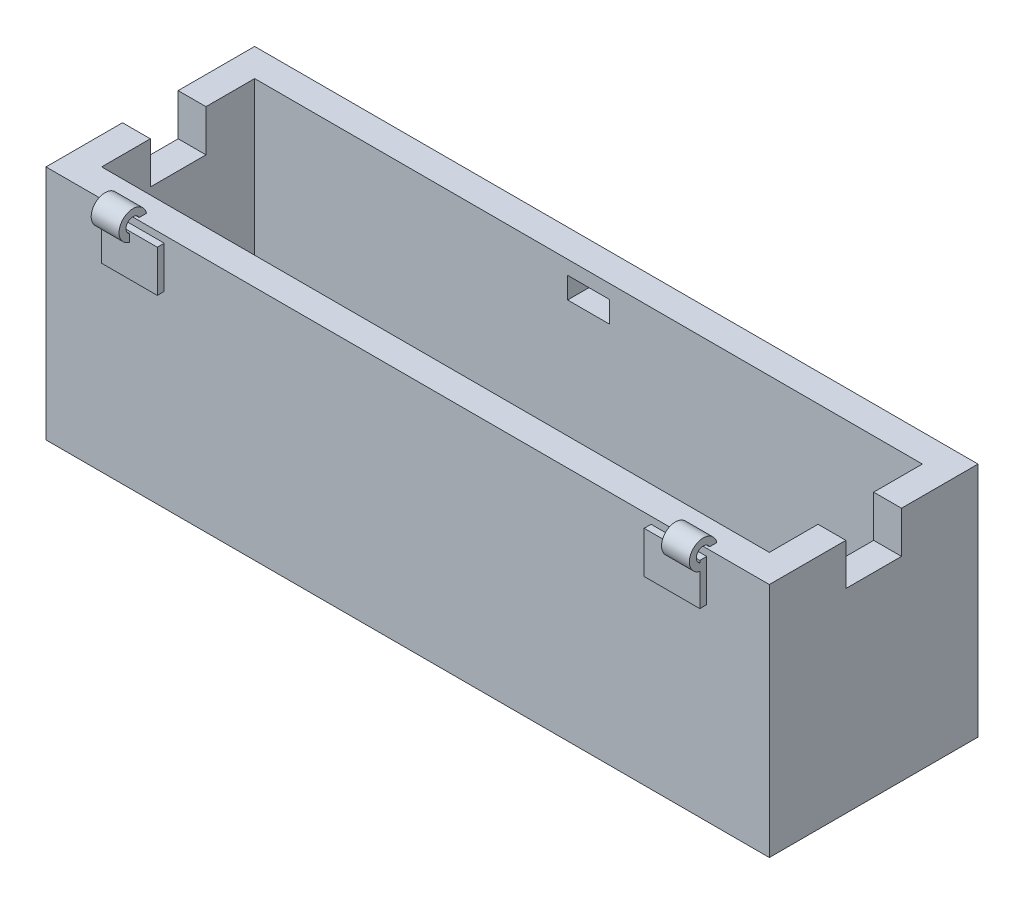
ISO-10303-21;
HEADER;
FILE_DESCRIPTION(('STEP AP214'),'2;1');
FILE_NAME('part.step','',(''),(''),'','','');
FILE_SCHEMA(('AUTOMOTIVE_DESIGN { 1 0 10303 214 1 1 1 1 }'));
ENDSEC;
DATA;
#1=APPLICATION_CONTEXT('core data for automotive mechanical design processes');
#2=APPLICATION_PROTOCOL_DEFINITION('international standard','automotive_design',2000,#1);
#3=PRODUCT_CONTEXT('',#1,'mechanical');
#4=PRODUCT('Part','Part','',(#3));
#5=PRODUCT_RELATED_PRODUCT_CATEGORY('part','',(#4));
#6=PRODUCT_DEFINITION_FORMATION('','',#4);
#7=PRODUCT_DEFINITION_CONTEXT('part definition',#1,'design');
#8=PRODUCT_DEFINITION('design','',#6,#7);
#9=PRODUCT_DEFINITION_SHAPE('','',#8);
#10=(LENGTH_UNIT() NAMED_UNIT(*) SI_UNIT(.MILLI.,.METRE.));
#11=(NAMED_UNIT(*) PLANE_ANGLE_UNIT() SI_UNIT($,.RADIAN.));
#12=(NAMED_UNIT(*) SI_UNIT($,.STERADIAN.) SOLID_ANGLE_UNIT());
#13=UNCERTAINTY_MEASURE_WITH_UNIT(LENGTH_MEASURE(1.E-05),#10,'distance_accuracy_value','');
#14=(GEOMETRIC_REPRESENTATION_CONTEXT(3) GLOBAL_UNCERTAINTY_ASSIGNED_CONTEXT((#13)) GLOBAL_UNIT_ASSIGNED_CONTEXT((#10,
#11,#12)) REPRESENTATION_CONTEXT('',''));
#15=CARTESIAN_POINT('',(0.,0.,0.));
#16=DIRECTION('',(0.,0.,1.));
#17=DIRECTION('',(1.,0.,0.));
#18=AXIS2_PLACEMENT_3D('',#15,#16,#17);
#19=CARTESIAN_POINT('',(0.,140.,0.));
#20=DIRECTION('',(0.,1.,0.));
#21=DIRECTION('',(0.,0.,1.));
#22=AXIS2_PLACEMENT_3D('',#19,#20,#21);
#23=PLANE('',#22);
#24=DIRECTION('',(-1.,0.,0.));
#25=VECTOR('',#24,1.);
#26=CARTESIAN_POINT('',(260.,140.,-20.0000000000002));
#27=LINE('',#26,#25);
#28=CARTESIAN_POINT('',(260.,140.,-20.0000000000002));
#29=VERTEX_POINT('',#28);
#30=CARTESIAN_POINT('',(240.,140.,-20.0000000000002));
#31=VERTEX_POINT('',#30);
#32=EDGE_CURVE('E340',#29,#31,#27,.T.);
#33=ORIENTED_EDGE('',*,*,#32,.F.);
#34=DIRECTION('',(0.,0.,-1.));
#35=VECTOR('',#34,1.);
#36=CARTESIAN_POINT('',(260.,140.,-75.));
#37=LINE('',#36,#35);
#38=CARTESIAN_POINT('',(260.,140.,-75.));
#39=VERTEX_POINT('',#38);
#40=EDGE_CURVE('E500',#29,#39,#37,.T.);
#41=ORIENTED_EDGE('',*,*,#40,.T.);
#42=DIRECTION('',(-1.,0.,0.));
#43=VECTOR('',#42,1.);
#44=CARTESIAN_POINT('',(-260.,140.,-75.));
#45=LINE('',#44,#43);
#46=CARTESIAN_POINT('',(15.,140.,-75.));
#47=VERTEX_POINT('',#46);
#48=EDGE_CURVE('E512',#39,#47,#45,.T.);
#49=ORIENTED_EDGE('',*,*,#48,.T.);
#50=CARTESIAN_POINT('',(-15.0000000000001,140.,-75.));
#51=VERTEX_POINT('',#50);
#52=EDGE_CURVE('E515',#47,#51,#45,.T.);
#53=ORIENTED_EDGE('',*,*,#52,.T.);
#54=CARTESIAN_POINT('',(-260.,140.,-75.));
#55=VERTEX_POINT('',#54);
#56=EDGE_CURVE('E511',#51,#55,#45,.T.);
#57=ORIENTED_EDGE('',*,*,#56,.T.);
#58=DIRECTION('',(0.,0.,1.));
#59=VECTOR('',#58,1.);
#60=CARTESIAN_POINT('',(-260.,140.,-75.));
#61=LINE('',#60,#59);
#62=CARTESIAN_POINT('',(-260.,140.,-20.));
#63=VERTEX_POINT('',#62);
#64=EDGE_CURVE('E516',#55,#63,#61,.T.);
#65=ORIENTED_EDGE('',*,*,#64,.T.);
#66=CARTESIAN_POINT('',(-240.,140.,-20.));
#67=VERTEX_POINT('',#66);
#68=EDGE_CURVE('E343',#67,#63,#27,.T.);
#69=ORIENTED_EDGE('',*,*,#68,.F.);
#70=DIRECTION('',(0.,0.,1.));
#71=VECTOR('',#70,1.);
#72=CARTESIAN_POINT('',(-240.,140.,-55.));
#73=LINE('',#72,#71);
#74=CARTESIAN_POINT('',(-240.,140.,-55.));
#75=VERTEX_POINT('',#74);
#76=EDGE_CURVE('E493',#75,#67,#73,.T.);
#77=ORIENTED_EDGE('',*,*,#76,.F.);
#78=DIRECTION('',(-1.,0.,0.));
#79=VECTOR('',#78,1.);
#80=CARTESIAN_POINT('',(-240.,140.,-55.));
#81=LINE('',#80,#79);
#82=CARTESIAN_POINT('',(240.,140.,-55.));
#83=VERTEX_POINT('',#82);
#84=EDGE_CURVE('E489',#83,#75,#81,.T.);
#85=ORIENTED_EDGE('',*,*,#84,.F.);
#86=DIRECTION('',(0.,0.,-1.));
#87=VECTOR('',#86,1.);
#88=CARTESIAN_POINT('',(240.,140.,-55.));
#89=LINE('',#88,#87);
#90=EDGE_CURVE('E471',#31,#83,#89,.T.);
#91=ORIENTED_EDGE('',*,*,#90,.F.);
#92=EDGE_LOOP('',(#33,#41,#49,#53,#57,#65,#69,#77,#85,#91));
#93=FACE_BOUND('',#92,.T.);
#94=ADVANCED_FACE('F45',(#93),#23,.T.);
#95=CARTESIAN_POINT('',(260.,140.,-75.));
#96=DIRECTION('',(-1.,0.,0.));
#97=DIRECTION('',(0.,0.,1.));
#98=AXIS2_PLACEMENT_3D('',#95,#96,#97);
#99=PLANE('',#98);
#100=ORIENTED_EDGE('',*,*,#40,.F.);
#101=DIRECTION('',(0.,-1.,0.));
#102=VECTOR('',#101,1.);
#103=CARTESIAN_POINT('',(260.,140.,-20.0000000000002));
#104=LINE('',#103,#102);
#105=CARTESIAN_POINT('',(260.,110.,-20.0000000000002));
#106=VERTEX_POINT('',#105);
#107=EDGE_CURVE('E323',#29,#106,#104,.T.);
#108=ORIENTED_EDGE('',*,*,#107,.T.);
#109=DIRECTION('',(0.,0.,1.));
#110=VECTOR('',#109,1.);
#111=CARTESIAN_POINT('',(260.,110.,-20.0000000000002));
#112=LINE('',#111,#110);
#113=CARTESIAN_POINT('',(260.,110.,19.9999999999998));
#114=VERTEX_POINT('',#113);
#115=EDGE_CURVE('E326',#106,#114,#112,.T.);
#116=ORIENTED_EDGE('',*,*,#115,.T.);
#117=DIRECTION('',(0.,1.,0.));
#118=VECTOR('',#117,1.);
#119=CARTESIAN_POINT('',(260.,140.,19.9999999999998));
#120=LINE('',#119,#118);
#121=CARTESIAN_POINT('',(260.,140.,19.9999999999998));
#122=VERTEX_POINT('',#121);
#123=EDGE_CURVE('E330',#114,#122,#120,.T.);
#124=ORIENTED_EDGE('',*,*,#123,.T.);
#125=CARTESIAN_POINT('',(260.,140.,75.));
#126=VERTEX_POINT('',#125);
#127=EDGE_CURVE('E508',#126,#122,#37,.T.);
#128=ORIENTED_EDGE('',*,*,#127,.F.);
#129=DIRECTION('',(0.,-1.,0.));
#130=VECTOR('',#129,1.);
#131=CARTESIAN_POINT('',(260.,140.,75.));
#132=LINE('',#131,#130);
#133=CARTESIAN_POINT('',(260.,-30.,75.));
#134=VERTEX_POINT('',#133);
#135=EDGE_CURVE('E521',#126,#134,#132,.T.);
#136=ORIENTED_EDGE('',*,*,#135,.T.);
#137=DIRECTION('',(0.,0.,1.));
#138=VECTOR('',#137,1.);
#139=CARTESIAN_POINT('',(260.,-30.,-75.));
#140=LINE('',#139,#138);
#141=CARTESIAN_POINT('',(260.,-30.,-75.));
#142=VERTEX_POINT('',#141);
#143=EDGE_CURVE('E316',#142,#134,#140,.T.);
#144=ORIENTED_EDGE('',*,*,#143,.F.);
#145=DIRECTION('',(0.,-1.,0.));
#146=VECTOR('',#145,1.);
#147=CARTESIAN_POINT('',(260.,140.,-75.));
#148=LINE('',#147,#146);
#149=EDGE_CURVE('E527',#39,#142,#148,.T.);
#150=ORIENTED_EDGE('',*,*,#149,.F.);
#151=EDGE_LOOP('',(#100,#108,#116,#124,#128,#136,#144,#150));
#152=FACE_BOUND('',#151,.T.);
#153=ADVANCED_FACE('F608',(#152),#99,.F.);
#154=CARTESIAN_POINT('',(-260.,140.,-75.));
#155=DIRECTION('',(0.,0.,1.));
#156=DIRECTION('',(1.,0.,0.));
#157=AXIS2_PLACEMENT_3D('',#154,#155,#156);
#158=PLANE('',#157);
#159=DIRECTION('',(0.,-1.,0.));
#160=VECTOR('',#159,1.);
#161=CARTESIAN_POINT('',(15.,130.,-75.));
#162=LINE('',#161,#160);
#163=CARTESIAN_POINT('',(15.,114.647041027345,-75.));
#164=VERTEX_POINT('',#163);
#165=EDGE_CURVE('E67',#47,#164,#162,.T.);
#166=ORIENTED_EDGE('',*,*,#165,.F.);
#167=ORIENTED_EDGE('',*,*,#48,.F.);
#168=ORIENTED_EDGE('',*,*,#149,.T.);
#169=DIRECTION('',(1.,0.,0.));
#170=VECTOR('',#169,1.);
#171=CARTESIAN_POINT('',(-260.,-30.,-75.));
#172=LINE('',#171,#170);
#173=CARTESIAN_POINT('',(-260.,-30.,-75.));
#174=VERTEX_POINT('',#173);
#175=EDGE_CURVE('E313',#174,#142,#172,.T.);
#176=ORIENTED_EDGE('',*,*,#175,.F.);
#177=DIRECTION('',(0.,-1.,0.));
#178=VECTOR('',#177,1.);
#179=CARTESIAN_POINT('',(-260.,140.,-75.));
#180=LINE('',#179,#178);
#181=EDGE_CURVE('E525',#55,#174,#180,.T.);
#182=ORIENTED_EDGE('',*,*,#181,.F.);
#183=ORIENTED_EDGE('',*,*,#56,.F.);
#184=DIRECTION('',(0.,1.,0.));
#185=VECTOR('',#184,1.);
#186=CARTESIAN_POINT('',(-15.0000000000001,130.,-75.));
#187=LINE('',#186,#185);
#188=CARTESIAN_POINT('',(-15.0000000000001,114.647041027345,-75.));
#189=VERTEX_POINT('',#188);
#190=EDGE_CURVE('E59',#189,#51,#187,.T.);
#191=ORIENTED_EDGE('',*,*,#190,.F.);
#192=DIRECTION('',(-1.,0.,0.));
#193=VECTOR('',#192,1.);
#194=CARTESIAN_POINT('',(15.,114.647041027345,-75.));
#195=LINE('',#194,#193);
#196=EDGE_CURVE('E288',#164,#189,#195,.T.);
#197=ORIENTED_EDGE('',*,*,#196,.F.);
#198=EDGE_LOOP('',(#166,#167,#168,#176,#182,#183,#191,#197));
#199=FACE_BOUND('',#198,.T.);
#200=ADVANCED_FACE('F301',(#199),#158,.F.);
#201=CARTESIAN_POINT('',(-260.,140.,-75.));
#202=DIRECTION('',(1.,0.,0.));
#203=DIRECTION('',(0.,0.,-1.));
#204=AXIS2_PLACEMENT_3D('',#201,#202,#203);
#205=PLANE('',#204);
#206=DIRECTION('',(0.,0.,1.));
#207=VECTOR('',#206,1.);
#208=CARTESIAN_POINT('',(-260.,110.,-20.));
#209=LINE('',#208,#207);
#210=CARTESIAN_POINT('',(-260.,110.,-20.));
#211=VERTEX_POINT('',#210);
#212=CARTESIAN_POINT('',(-260.,110.,20.));
#213=VERTEX_POINT('',#212);
#214=EDGE_CURVE('E336',#211,#213,#209,.T.);
#215=ORIENTED_EDGE('',*,*,#214,.F.);
#216=DIRECTION('',(0.,-1.,0.));
#217=VECTOR('',#216,1.);
#218=CARTESIAN_POINT('',(-260.,140.,-20.));
#219=LINE('',#218,#217);
#220=EDGE_CURVE('E322',#63,#211,#219,.T.);
#221=ORIENTED_EDGE('',*,*,#220,.F.);
#222=ORIENTED_EDGE('',*,*,#64,.F.);
#223=ORIENTED_EDGE('',*,*,#181,.T.);
#224=DIRECTION('',(0.,0.,-1.));
#225=VECTOR('',#224,1.);
#226=CARTESIAN_POINT('',(-260.,-30.,-75.));
#227=LINE('',#226,#225);
#228=CARTESIAN_POINT('',(-260.,-30.,75.));
#229=VERTEX_POINT('',#228);
#230=EDGE_CURVE('E308',#229,#174,#227,.T.);
#231=ORIENTED_EDGE('',*,*,#230,.F.);
#232=DIRECTION('',(0.,-1.,0.));
#233=VECTOR('',#232,1.);
#234=CARTESIAN_POINT('',(-260.,140.,75.));
#235=LINE('',#234,#233);
#236=CARTESIAN_POINT('',(-260.,140.,75.));
#237=VERTEX_POINT('',#236);
#238=EDGE_CURVE('E523',#237,#229,#235,.T.);
#239=ORIENTED_EDGE('',*,*,#238,.F.);
#240=CARTESIAN_POINT('',(-260.,140.,20.));
#241=VERTEX_POINT('',#240);
#242=EDGE_CURVE('E514',#241,#237,#61,.T.);
#243=ORIENTED_EDGE('',*,*,#242,.F.);
#244=DIRECTION('',(0.,1.,0.));
#245=VECTOR('',#244,1.);
#246=CARTESIAN_POINT('',(-260.,140.,20.));
#247=LINE('',#246,#245);
#248=EDGE_CURVE('E327',#213,#241,#247,.T.);
#249=ORIENTED_EDGE('',*,*,#248,.F.);
#250=EDGE_LOOP('',(#215,#221,#222,#223,#231,#239,#243,#249));
#251=FACE_BOUND('',#250,.T.);
#252=ADVANCED_FACE('F587',(#251),#205,.F.);
#253=CARTESIAN_POINT('',(-260.,140.,75.));
#254=DIRECTION('',(0.,0.,-1.));
#255=DIRECTION('',(-1.,0.,0.));
#256=AXIS2_PLACEMENT_3D('',#253,#254,#255);
#257=PLANE('',#256);
#258=DIRECTION('',(1.,0.,0.));
#259=VECTOR('',#258,1.);
#260=CARTESIAN_POINT('',(-260.,135.,75.));
#261=LINE('',#260,#259);
#262=CARTESIAN_POINT('',(175.,135.,75.));
#263=VERTEX_POINT('',#262);
#264=CARTESIAN_POINT('',(215.,135.,75.));
#265=VERTEX_POINT('',#264);
#266=EDGE_CURVE('E421',#263,#265,#261,.T.);
#267=ORIENTED_EDGE('',*,*,#266,.T.);
#268=DIRECTION('',(0.,-1.,0.));
#269=VECTOR('',#268,1.);
#270=CARTESIAN_POINT('',(215.,140.,75.));
#271=LINE('',#270,#269);
#272=CARTESIAN_POINT('',(215.,105.,75.));
#273=VERTEX_POINT('',#272);
#274=EDGE_CURVE('E436',#265,#273,#271,.T.);
#275=ORIENTED_EDGE('',*,*,#274,.T.);
#276=DIRECTION('',(-1.,0.,0.));
#277=VECTOR('',#276,1.);
#278=CARTESIAN_POINT('',(-260.,105.,75.));
#279=LINE('',#278,#277);
#280=CARTESIAN_POINT('',(175.,105.,75.));
#281=VERTEX_POINT('',#280);
#282=EDGE_CURVE('E433',#273,#281,#279,.T.);
#283=ORIENTED_EDGE('',*,*,#282,.T.);
#284=DIRECTION('',(0.,1.,0.));
#285=VECTOR('',#284,1.);
#286=CARTESIAN_POINT('',(175.,140.,75.));
#287=LINE('',#286,#285);
#288=EDGE_CURVE('E430',#281,#263,#287,.T.);
#289=ORIENTED_EDGE('',*,*,#288,.T.);
#290=EDGE_LOOP('',(#267,#275,#283,#289));
#291=FACE_BOUND('',#290,.T.);
#292=DIRECTION('',(1.,0.,0.));
#293=VECTOR('',#292,1.);
#294=CARTESIAN_POINT('',(-260.,135.,75.));
#295=LINE('',#294,#293);
#296=CARTESIAN_POINT('',(-215.,135.,75.));
#297=VERTEX_POINT('',#296);
#298=CARTESIAN_POINT('',(-175.,135.,75.));
#299=VERTEX_POINT('',#298);
#300=EDGE_CURVE('E454',#297,#299,#295,.T.);
#301=ORIENTED_EDGE('',*,*,#300,.T.);
#302=DIRECTION('',(0.,-1.,0.));
#303=VECTOR('',#302,1.);
#304=CARTESIAN_POINT('',(-175.,140.,75.));
#305=LINE('',#304,#303);
#306=CARTESIAN_POINT('',(-175.,105.,75.));
#307=VERTEX_POINT('',#306);
#308=EDGE_CURVE('E468',#299,#307,#305,.T.);
#309=ORIENTED_EDGE('',*,*,#308,.T.);
#310=DIRECTION('',(-1.,0.,0.));
#311=VECTOR('',#310,1.);
#312=CARTESIAN_POINT('',(-260.,105.,75.));
#313=LINE('',#312,#311);
#314=CARTESIAN_POINT('',(-215.,105.,75.));
#315=VERTEX_POINT('',#314);
#316=EDGE_CURVE('E465',#307,#315,#313,.T.);
#317=ORIENTED_EDGE('',*,*,#316,.T.);
#318=DIRECTION('',(0.,1.,0.));
#319=VECTOR('',#318,1.);
#320=CARTESIAN_POINT('',(-215.,140.,75.));
#321=LINE('',#320,#319);
#322=EDGE_CURVE('E463',#315,#297,#321,.T.);
#323=ORIENTED_EDGE('',*,*,#322,.T.);
#324=EDGE_LOOP('',(#301,#309,#317,#323));
#325=FACE_BOUND('',#324,.T.);
#326=ORIENTED_EDGE('',*,*,#238,.T.);
#327=DIRECTION('',(-1.,0.,0.));
#328=VECTOR('',#327,1.);
#329=CARTESIAN_POINT('',(-260.,-30.,75.));
#330=LINE('',#329,#328);
#331=EDGE_CURVE('E319',#134,#229,#330,.T.);
#332=ORIENTED_EDGE('',*,*,#331,.F.);
#333=ORIENTED_EDGE('',*,*,#135,.F.);
#334=DIRECTION('',(1.,0.,0.));
#335=VECTOR('',#334,1.);
#336=CARTESIAN_POINT('',(-260.,140.,75.));
#337=LINE('',#336,#335);
#338=EDGE_CURVE('E519',#237,#126,#337,.T.);
#339=ORIENTED_EDGE('',*,*,#338,.F.);
#340=EDGE_LOOP('',(#326,#332,#333,#339));
#341=FACE_BOUND('',#340,.T.);
#342=ADVANCED_FACE('F618',(#291,#325,#341),#257,.F.);
#343=DIRECTION('',(-1.,0.,0.));
#344=VECTOR('',#343,1.);
#345=CARTESIAN_POINT('',(260.,140.,19.9999999999998));
#346=LINE('',#345,#344);
#347=CARTESIAN_POINT('',(-240.,140.,20.));
#348=VERTEX_POINT('',#347);
#349=EDGE_CURVE('E347',#348,#241,#346,.T.);
#350=ORIENTED_EDGE('',*,*,#349,.T.);
#351=ORIENTED_EDGE('',*,*,#242,.T.);
#352=ORIENTED_EDGE('',*,*,#338,.T.);
#353=ORIENTED_EDGE('',*,*,#127,.T.);
#354=CARTESIAN_POINT('',(240.,140.,19.9999999999998));
#355=VERTEX_POINT('',#354);
#356=EDGE_CURVE('E344',#122,#355,#346,.T.);
#357=ORIENTED_EDGE('',*,*,#356,.T.);
#358=CARTESIAN_POINT('',(240.,140.,55.));
#359=VERTEX_POINT('',#358);
#360=EDGE_CURVE('E486',#359,#355,#89,.T.);
#361=ORIENTED_EDGE('',*,*,#360,.F.);
#362=DIRECTION('',(1.,0.,0.));
#363=VECTOR('',#362,1.);
#364=CARTESIAN_POINT('',(-240.,140.,55.));
#365=LINE('',#364,#363);
#366=CARTESIAN_POINT('',(-240.,140.,55.));
#367=VERTEX_POINT('',#366);
#368=EDGE_CURVE('E476',#367,#359,#365,.T.);
#369=ORIENTED_EDGE('',*,*,#368,.F.);
#370=EDGE_CURVE('E492',#348,#367,#73,.T.);
#371=ORIENTED_EDGE('',*,*,#370,.F.);
#372=EDGE_LOOP('',(#350,#351,#352,#353,#357,#361,#369,#371));
#373=FACE_BOUND('',#372,.T.);
#374=DIRECTION('',(-1.,0.,0.));
#375=VECTOR('',#374,1.);
#376=CARTESIAN_POINT('',(-195.,140.,67.7530526368508));
#377=LINE('',#376,#375);
#378=CARTESIAN_POINT('',(-195.,140.,67.7530526368508));
#379=VERTEX_POINT('',#378);
#380=CARTESIAN_POINT('',(-215.,140.,67.7530526368508));
#381=VERTEX_POINT('',#380);
#382=EDGE_CURVE('E382',#379,#381,#377,.T.);
#383=ORIENTED_EDGE('',*,*,#382,.F.);
#384=DIRECTION('',(0.,0.,1.));
#385=VECTOR('',#384,1.);
#386=CARTESIAN_POINT('',(-195.,140.,0.));
#387=LINE('',#386,#385);
#388=CARTESIAN_POINT('',(-195.,140.,73.0275305590748));
#389=VERTEX_POINT('',#388);
#390=EDGE_CURVE('E379',#379,#389,#387,.T.);
#391=ORIENTED_EDGE('',*,*,#390,.T.);
#392=DIRECTION('',(-1.,0.,0.));
#393=VECTOR('',#392,1.);
#394=CARTESIAN_POINT('',(-195.,140.,73.0275305590748));
#395=LINE('',#394,#393);
#396=CARTESIAN_POINT('',(-215.,140.,73.0275305590748));
#397=VERTEX_POINT('',#396);
#398=EDGE_CURVE('E371',#389,#397,#395,.T.);
#399=ORIENTED_EDGE('',*,*,#398,.T.);
#400=DIRECTION('',(0.,0.,1.));
#401=VECTOR('',#400,1.);
#402=CARTESIAN_POINT('',(-215.,140.,0.));
#403=LINE('',#402,#401);
#404=EDGE_CURVE('E376',#381,#397,#403,.T.);
#405=ORIENTED_EDGE('',*,*,#404,.F.);
#406=EDGE_LOOP('',(#383,#391,#399,#405));
#407=FACE_BOUND('',#406,.T.);
#408=DIRECTION('',(1.,0.,0.));
#409=VECTOR('',#408,1.);
#410=CARTESIAN_POINT('',(195.,140.,67.7530526368488));
#411=LINE('',#410,#409);
#412=CARTESIAN_POINT('',(215.,140.,67.7530526368488));
#413=VERTEX_POINT('',#412);
#414=CARTESIAN_POINT('',(195.,140.,67.7530526368488));
#415=VERTEX_POINT('',#414);
#416=EDGE_CURVE('E403',#413,#415,#411,.F.);
#417=ORIENTED_EDGE('',*,*,#416,.F.);
#418=DIRECTION('',(0.,0.,-1.));
#419=VECTOR('',#418,1.);
#420=CARTESIAN_POINT('',(215.,140.,0.));
#421=LINE('',#420,#419);
#422=CARTESIAN_POINT('',(215.,140.,73.0275305590714));
#423=VERTEX_POINT('',#422);
#424=EDGE_CURVE('E398',#423,#413,#421,.T.);
#425=ORIENTED_EDGE('',*,*,#424,.F.);
#426=DIRECTION('',(1.,0.,0.));
#427=VECTOR('',#426,1.);
#428=CARTESIAN_POINT('',(195.,140.,73.0275305590714));
#429=LINE('',#428,#427);
#430=CARTESIAN_POINT('',(195.,140.,73.0275305590714));
#431=VERTEX_POINT('',#430);
#432=EDGE_CURVE('E393',#423,#431,#429,.F.);
#433=ORIENTED_EDGE('',*,*,#432,.T.);
#434=DIRECTION('',(0.,0.,-1.));
#435=VECTOR('',#434,1.);
#436=CARTESIAN_POINT('',(195.,140.,0.));
#437=LINE('',#436,#435);
#438=EDGE_CURVE('E400',#431,#415,#437,.T.);
#439=ORIENTED_EDGE('',*,*,#438,.T.);
#440=EDGE_LOOP('',(#417,#425,#433,#439));
#441=FACE_BOUND('',#440,.T.);
#442=ADVANCED_FACE('F623',(#373,#407,#441),#23,.T.);
#443=CARTESIAN_POINT('',(240.,20.,-55.));
#444=DIRECTION('',(1.,0.,0.));
#445=DIRECTION('',(0.,0.,-1.));
#446=AXIS2_PLACEMENT_3D('',#443,#444,#445);
#447=PLANE('',#446);
#448=DIRECTION('',(0.,0.,-1.));
#449=VECTOR('',#448,1.);
#450=CARTESIAN_POINT('',(240.,110.,-55.));
#451=LINE('',#450,#449);
#452=CARTESIAN_POINT('',(240.,110.,19.9999999999998));
#453=VERTEX_POINT('',#452);
#454=CARTESIAN_POINT('',(240.,110.,-20.0000000000002));
#455=VERTEX_POINT('',#454);
#456=EDGE_CURVE('E342',#453,#455,#451,.T.);
#457=ORIENTED_EDGE('',*,*,#456,.T.);
#458=DIRECTION('',(0.,1.,0.));
#459=VECTOR('',#458,1.);
#460=CARTESIAN_POINT('',(240.,20.,-20.0000000000002));
#461=LINE('',#460,#459);
#462=EDGE_CURVE('E359',#455,#31,#461,.T.);
#463=ORIENTED_EDGE('',*,*,#462,.T.);
#464=ORIENTED_EDGE('',*,*,#90,.T.);
#465=DIRECTION('',(0.,1.,0.));
#466=VECTOR('',#465,1.);
#467=CARTESIAN_POINT('',(240.,20.,-55.));
#468=LINE('',#467,#466);
#469=CARTESIAN_POINT('',(240.,20.,-55.));
#470=VERTEX_POINT('',#469);
#471=EDGE_CURVE('E485',#470,#83,#468,.T.);
#472=ORIENTED_EDGE('',*,*,#471,.F.);
#473=DIRECTION('',(0.,0.,-1.));
#474=VECTOR('',#473,1.);
#475=CARTESIAN_POINT('',(240.,20.,-55.));
#476=LINE('',#475,#474);
#477=CARTESIAN_POINT('',(240.,20.,55.));
#478=VERTEX_POINT('',#477);
#479=EDGE_CURVE('E472',#478,#470,#476,.T.);
#480=ORIENTED_EDGE('',*,*,#479,.F.);
#481=DIRECTION('',(0.,1.,0.));
#482=VECTOR('',#481,1.);
#483=CARTESIAN_POINT('',(240.,20.,55.));
#484=LINE('',#483,#482);
#485=EDGE_CURVE('E498',#478,#359,#484,.T.);
#486=ORIENTED_EDGE('',*,*,#485,.T.);
#487=ORIENTED_EDGE('',*,*,#360,.T.);
#488=DIRECTION('',(0.,-1.,0.));
#489=VECTOR('',#488,1.);
#490=CARTESIAN_POINT('',(240.,20.,19.9999999999998));
#491=LINE('',#490,#489);
#492=EDGE_CURVE('E356',#355,#453,#491,.T.);
#493=ORIENTED_EDGE('',*,*,#492,.T.);
#494=EDGE_LOOP('',(#457,#463,#464,#472,#480,#486,#487,#493));
#495=FACE_BOUND('',#494,.T.);
#496=ADVANCED_FACE('F601',(#495),#447,.F.);
#497=CARTESIAN_POINT('',(-240.,20.,55.));
#498=DIRECTION('',(0.,0.,1.));
#499=DIRECTION('',(1.,0.,0.));
#500=AXIS2_PLACEMENT_3D('',#497,#498,#499);
#501=PLANE('',#500);
#502=ORIENTED_EDGE('',*,*,#368,.T.);
#503=ORIENTED_EDGE('',*,*,#485,.F.);
#504=DIRECTION('',(1.,0.,0.));
#505=VECTOR('',#504,1.);
#506=CARTESIAN_POINT('',(-240.,20.,55.));
#507=LINE('',#506,#505);
#508=CARTESIAN_POINT('',(-240.,20.,55.));
#509=VERTEX_POINT('',#508);
#510=EDGE_CURVE('E482',#509,#478,#507,.T.);
#511=ORIENTED_EDGE('',*,*,#510,.F.);
#512=DIRECTION('',(0.,1.,0.));
#513=VECTOR('',#512,1.);
#514=CARTESIAN_POINT('',(-240.,20.,55.));
#515=LINE('',#514,#513);
#516=EDGE_CURVE('E501',#509,#367,#515,.T.);
#517=ORIENTED_EDGE('',*,*,#516,.T.);
#518=EDGE_LOOP('',(#502,#503,#511,#517));
#519=FACE_BOUND('',#518,.T.);
#520=ADVANCED_FACE('F660',(#519),#501,.F.);
#521=CARTESIAN_POINT('',(-240.,20.,-55.));
#522=DIRECTION('',(-1.,0.,0.));
#523=DIRECTION('',(0.,0.,1.));
#524=AXIS2_PLACEMENT_3D('',#521,#522,#523);
#525=PLANE('',#524);
#526=ORIENTED_EDGE('',*,*,#76,.T.);
#527=DIRECTION('',(0.,-1.,0.));
#528=VECTOR('',#527,1.);
#529=CARTESIAN_POINT('',(-240.,20.,-20.));
#530=LINE('',#529,#528);
#531=CARTESIAN_POINT('',(-240.,110.,-20.));
#532=VERTEX_POINT('',#531);
#533=EDGE_CURVE('E551',#67,#532,#530,.T.);
#534=ORIENTED_EDGE('',*,*,#533,.T.);
#535=DIRECTION('',(0.,0.,1.));
#536=VECTOR('',#535,1.);
#537=CARTESIAN_POINT('',(-240.,110.,-55.));
#538=LINE('',#537,#536);
#539=CARTESIAN_POINT('',(-240.,110.,20.));
#540=VERTEX_POINT('',#539);
#541=EDGE_CURVE('E545',#532,#540,#538,.T.);
#542=ORIENTED_EDGE('',*,*,#541,.T.);
#543=DIRECTION('',(0.,1.,0.));
#544=VECTOR('',#543,1.);
#545=CARTESIAN_POINT('',(-240.,20.,20.));
#546=LINE('',#545,#544);
#547=EDGE_CURVE('E548',#540,#348,#546,.T.);
#548=ORIENTED_EDGE('',*,*,#547,.T.);
#549=ORIENTED_EDGE('',*,*,#370,.T.);
#550=ORIENTED_EDGE('',*,*,#516,.F.);
#551=DIRECTION('',(0.,0.,1.));
#552=VECTOR('',#551,1.);
#553=CARTESIAN_POINT('',(-240.,20.,-55.));
#554=LINE('',#553,#552);
#555=CARTESIAN_POINT('',(-240.,20.,-55.));
#556=VERTEX_POINT('',#555);
#557=EDGE_CURVE('E479',#556,#509,#554,.T.);
#558=ORIENTED_EDGE('',*,*,#557,.F.);
#559=DIRECTION('',(0.,1.,0.));
#560=VECTOR('',#559,1.);
#561=CARTESIAN_POINT('',(-240.,20.,-55.));
#562=LINE('',#561,#560);
#563=EDGE_CURVE('E504',#556,#75,#562,.T.);
#564=ORIENTED_EDGE('',*,*,#563,.T.);
#565=EDGE_LOOP('',(#526,#534,#542,#548,#549,#550,#558,#564));
#566=FACE_BOUND('',#565,.T.);
#567=ADVANCED_FACE('F595',(#566),#525,.F.);
#568=CARTESIAN_POINT('',(-240.,20.,-55.));
#569=DIRECTION('',(0.,0.,-1.));
#570=DIRECTION('',(-1.,0.,0.));
#571=AXIS2_PLACEMENT_3D('',#568,#569,#570);
#572=PLANE('',#571);
#573=DIRECTION('',(-1.,0.,0.));
#574=VECTOR('',#573,1.);
#575=CARTESIAN_POINT('',(-240.,114.647041027345,-55.));
#576=LINE('',#575,#574);
#577=CARTESIAN_POINT('',(15.,114.647041027345,-55.));
#578=VERTEX_POINT('',#577);
#579=CARTESIAN_POINT('',(-15.0000000000001,114.647041027345,-55.));
#580=VERTEX_POINT('',#579);
#581=EDGE_CURVE('E290',#578,#580,#576,.T.);
#582=ORIENTED_EDGE('',*,*,#581,.T.);
#583=DIRECTION('',(0.,1.,0.));
#584=VECTOR('',#583,1.);
#585=CARTESIAN_POINT('',(-15.0000000000001,20.,-55.));
#586=LINE('',#585,#584);
#587=CARTESIAN_POINT('',(-15.0000000000001,130.,-55.));
#588=VERTEX_POINT('',#587);
#589=EDGE_CURVE('E560',#580,#588,#586,.T.);
#590=ORIENTED_EDGE('',*,*,#589,.T.);
#591=DIRECTION('',(1.,0.,0.));
#592=VECTOR('',#591,1.);
#593=CARTESIAN_POINT('',(-240.,130.,-55.));
#594=LINE('',#593,#592);
#595=CARTESIAN_POINT('',(15.,130.,-55.));
#596=VERTEX_POINT('',#595);
#597=EDGE_CURVE('E554',#588,#596,#594,.T.);
#598=ORIENTED_EDGE('',*,*,#597,.T.);
#599=DIRECTION('',(0.,-1.,0.));
#600=VECTOR('',#599,1.);
#601=CARTESIAN_POINT('',(14.9999999999999,20.,-55.));
#602=LINE('',#601,#600);
#603=EDGE_CURVE('E557',#596,#578,#602,.T.);
#604=ORIENTED_EDGE('',*,*,#603,.T.);
#605=EDGE_LOOP('',(#582,#590,#598,#604));
#606=FACE_BOUND('',#605,.T.);
#607=ORIENTED_EDGE('',*,*,#84,.T.);
#608=ORIENTED_EDGE('',*,*,#563,.F.);
#609=DIRECTION('',(-1.,0.,0.));
#610=VECTOR('',#609,1.);
#611=CARTESIAN_POINT('',(-240.,20.,-55.));
#612=LINE('',#611,#610);
#613=EDGE_CURVE('E475',#470,#556,#612,.T.);
#614=ORIENTED_EDGE('',*,*,#613,.F.);
#615=ORIENTED_EDGE('',*,*,#471,.T.);
#616=EDGE_LOOP('',(#607,#608,#614,#615));
#617=FACE_BOUND('',#616,.T.);
#618=ADVANCED_FACE('F572',(#606,#617),#572,.F.);
#619=CARTESIAN_POINT('',(0.,20.,0.));
#620=DIRECTION('',(0.,1.,0.));
#621=DIRECTION('',(0.,0.,1.));
#622=AXIS2_PLACEMENT_3D('',#619,#620,#621);
#623=PLANE('',#622);
#624=ORIENTED_EDGE('',*,*,#479,.T.);
#625=ORIENTED_EDGE('',*,*,#613,.T.);
#626=ORIENTED_EDGE('',*,*,#557,.T.);
#627=ORIENTED_EDGE('',*,*,#510,.T.);
#628=EDGE_LOOP('',(#624,#625,#626,#627));
#629=FACE_BOUND('',#628,.T.);
#630=ADVANCED_FACE('F717',(#629),#623,.T.);
#631=CARTESIAN_POINT('',(-175.,135.,50.));
#632=DIRECTION('',(1.,0.,0.));
#633=DIRECTION('',(0.,0.,-1.));
#634=AXIS2_PLACEMENT_3D('',#631,#632,#633);
#635=PLANE('',#634);
#636=ORIENTED_EDGE('',*,*,#308,.F.);
#637=DIRECTION('',(0.,0.,1.));
#638=VECTOR('',#637,1.);
#639=CARTESIAN_POINT('',(-175.,135.,50.));
#640=LINE('',#639,#638);
#641=CARTESIAN_POINT('',(-175.,135.,80.));
#642=VERTEX_POINT('',#641);
#643=EDGE_CURVE('E451',#299,#642,#640,.T.);
#644=ORIENTED_EDGE('',*,*,#643,.T.);
#645=DIRECTION('',(0.,1.,0.));
#646=VECTOR('',#645,1.);
#647=CARTESIAN_POINT('',(-175.,135.,80.));
#648=LINE('',#647,#646);
#649=CARTESIAN_POINT('',(-175.,105.,80.));
#650=VERTEX_POINT('',#649);
#651=EDGE_CURVE('E438',#650,#642,#648,.T.);
#652=ORIENTED_EDGE('',*,*,#651,.F.);
#653=DIRECTION('',(0.,0.,1.));
#654=VECTOR('',#653,1.);
#655=CARTESIAN_POINT('',(-175.,105.,50.));
#656=LINE('',#655,#654);
#657=EDGE_CURVE('E452',#307,#650,#656,.T.);
#658=ORIENTED_EDGE('',*,*,#657,.F.);
#659=EDGE_LOOP('',(#636,#644,#652,#658));
#660=FACE_BOUND('',#659,.T.);
#661=ADVANCED_FACE('F811',(#660),#635,.T.);
#662=CARTESIAN_POINT('',(-215.,105.,50.));
#663=DIRECTION('',(0.,-1.,0.));
#664=DIRECTION('',(1.,0.,0.));
#665=AXIS2_PLACEMENT_3D('',#662,#663,#664);
#666=PLANE('',#665);
#667=ORIENTED_EDGE('',*,*,#316,.F.);
#668=ORIENTED_EDGE('',*,*,#657,.T.);
#669=DIRECTION('',(1.,0.,0.));
#670=VECTOR('',#669,1.);
#671=CARTESIAN_POINT('',(-215.,105.,80.));
#672=LINE('',#671,#670);
#673=CARTESIAN_POINT('',(-215.,105.,80.));
#674=VERTEX_POINT('',#673);
#675=EDGE_CURVE('E448',#674,#650,#672,.T.);
#676=ORIENTED_EDGE('',*,*,#675,.F.);
#677=DIRECTION('',(0.,0.,1.));
#678=VECTOR('',#677,1.);
#679=CARTESIAN_POINT('',(-215.,105.,50.));
#680=LINE('',#679,#678);
#681=EDGE_CURVE('E455',#315,#674,#680,.T.);
#682=ORIENTED_EDGE('',*,*,#681,.F.);
#683=EDGE_LOOP('',(#667,#668,#676,#682));
#684=FACE_BOUND('',#683,.T.);
#685=ADVANCED_FACE('F815',(#684),#666,.T.);
#686=CARTESIAN_POINT('',(-215.,135.,50.));
#687=DIRECTION('',(-1.,0.,0.));
#688=DIRECTION('',(0.,0.,1.));
#689=AXIS2_PLACEMENT_3D('',#686,#687,#688);
#690=PLANE('',#689);
#691=DIRECTION('',(0.,-1.,0.));
#692=VECTOR('',#691,1.);
#693=CARTESIAN_POINT('',(-215.,135.,80.));
#694=LINE('',#693,#692);
#695=CARTESIAN_POINT('',(-215.,128.082140753213,80.));
#696=VERTEX_POINT('',#695);
#697=EDGE_CURVE('E444',#696,#674,#694,.T.);
#698=ORIENTED_EDGE('',*,*,#697,.F.);
#699=CARTESIAN_POINT('',(-215.,137.76459911873,77.4999999999999));
#700=DIRECTION('',(-1.,0.,0.));
#701=DIRECTION('',(0.,0.,1.));
#702=AXIS2_PLACEMENT_3D('',#699,#700,#701);
#703=CIRCLE('',#702,9.99999999999908);
#704=EDGE_CURVE('E366',#696,#381,#703,.T.);
#705=ORIENTED_EDGE('',*,*,#704,.T.);
#706=ORIENTED_EDGE('',*,*,#404,.T.);
#707=CARTESIAN_POINT('',(-215.,137.76459911873,77.4999999999999));
#708=DIRECTION('',(-1.,0.,0.));
#709=DIRECTION('',(0.,0.,1.));
#710=AXIS2_PLACEMENT_3D('',#707,#708,#709);
#711=CIRCLE('',#710,4.99999999999907);
#712=CARTESIAN_POINT('',(-215.,133.434472099809,80.));
#713=VERTEX_POINT('',#712);
#714=EDGE_CURVE('E362',#713,#397,#711,.T.);
#715=ORIENTED_EDGE('',*,*,#714,.F.);
#716=CARTESIAN_POINT('',(-215.,135.,80.));
#717=VERTEX_POINT('',#716);
#718=EDGE_CURVE('E445',#717,#713,#694,.T.);
#719=ORIENTED_EDGE('',*,*,#718,.F.);
#720=DIRECTION('',(0.,0.,1.));
#721=VECTOR('',#720,1.);
#722=CARTESIAN_POINT('',(-215.,135.,50.));
#723=LINE('',#722,#721);
#724=EDGE_CURVE('E458',#297,#717,#723,.T.);
#725=ORIENTED_EDGE('',*,*,#724,.F.);
#726=ORIENTED_EDGE('',*,*,#322,.F.);
#727=ORIENTED_EDGE('',*,*,#681,.T.);
#728=EDGE_LOOP('',(#698,#705,#706,#715,#719,#725,#726,#727));
#729=FACE_BOUND('',#728,.T.);
#730=ADVANCED_FACE('F821',(#729),#690,.T.);
#731=CARTESIAN_POINT('',(-215.,135.,50.));
#732=DIRECTION('',(0.,1.,0.));
#733=DIRECTION('',(0.,0.,1.));
#734=AXIS2_PLACEMENT_3D('',#731,#732,#733);
#735=PLANE('',#734);
#736=ORIENTED_EDGE('',*,*,#300,.F.);
#737=ORIENTED_EDGE('',*,*,#724,.T.);
#738=DIRECTION('',(-1.,0.,0.));
#739=VECTOR('',#738,1.);
#740=CARTESIAN_POINT('',(-215.,135.,80.));
#741=LINE('',#740,#739);
#742=EDGE_CURVE('E441',#642,#717,#741,.T.);
#743=ORIENTED_EDGE('',*,*,#742,.F.);
#744=ORIENTED_EDGE('',*,*,#643,.F.);
#745=EDGE_LOOP('',(#736,#737,#743,#744));
#746=FACE_BOUND('',#745,.T.);
#747=ADVANCED_FACE('F817',(#746),#735,.T.);
#748=CARTESIAN_POINT('',(0.,0.,80.));
#749=DIRECTION('',(0.,0.,1.));
#750=DIRECTION('',(1.,0.,0.));
#751=AXIS2_PLACEMENT_3D('',#748,#749,#750);
#752=PLANE('',#751);
#753=DIRECTION('',(-1.,0.,0.));
#754=VECTOR('',#753,1.);
#755=CARTESIAN_POINT('',(-195.,128.082140753213,80.));
#756=LINE('',#755,#754);
#757=CARTESIAN_POINT('',(-195.,128.082140753213,80.));
#758=VERTEX_POINT('',#757);
#759=EDGE_CURVE('E543',#696,#758,#756,.F.);
#760=ORIENTED_EDGE('',*,*,#759,.F.);
#761=ORIENTED_EDGE('',*,*,#697,.T.);
#762=ORIENTED_EDGE('',*,*,#675,.T.);
#763=ORIENTED_EDGE('',*,*,#651,.T.);
#764=ORIENTED_EDGE('',*,*,#742,.T.);
#765=ORIENTED_EDGE('',*,*,#718,.T.);
#766=DIRECTION('',(-1.,0.,0.));
#767=VECTOR('',#766,1.);
#768=CARTESIAN_POINT('',(-195.,133.434472099809,80.));
#769=LINE('',#768,#767);
#770=CARTESIAN_POINT('',(-195.,133.434472099809,80.));
#771=VERTEX_POINT('',#770);
#772=EDGE_CURVE('E537',#713,#771,#769,.F.);
#773=ORIENTED_EDGE('',*,*,#772,.T.);
#774=DIRECTION('',(0.,-1.,0.));
#775=VECTOR('',#774,1.);
#776=CARTESIAN_POINT('',(-195.,0.,80.));
#777=LINE('',#776,#775);
#778=EDGE_CURVE('E540',#771,#758,#777,.T.);
#779=ORIENTED_EDGE('',*,*,#778,.T.);
#780=EDGE_LOOP('',(#760,#761,#762,#763,#764,#765,#773,#779));
#781=FACE_BOUND('',#780,.T.);
#782=ADVANCED_FACE('F820',(#781),#752,.T.);
#783=CARTESIAN_POINT('',(215.,135.,50.));
#784=DIRECTION('',(1.,0.,0.));
#785=DIRECTION('',(0.,0.,-1.));
#786=AXIS2_PLACEMENT_3D('',#783,#784,#785);
#787=PLANE('',#786);
#788=DIRECTION('',(0.,0.,1.));
#789=VECTOR('',#788,1.);
#790=CARTESIAN_POINT('',(215.,105.,50.));
#791=LINE('',#790,#789);
#792=CARTESIAN_POINT('',(215.,105.,80.));
#793=VERTEX_POINT('',#792);
#794=EDGE_CURVE('E419',#273,#793,#791,.T.);
#795=ORIENTED_EDGE('',*,*,#794,.F.);
#796=ORIENTED_EDGE('',*,*,#274,.F.);
#797=DIRECTION('',(0.,0.,1.));
#798=VECTOR('',#797,1.);
#799=CARTESIAN_POINT('',(215.,135.,50.));
#800=LINE('',#799,#798);
#801=CARTESIAN_POINT('',(215.,135.,80.));
#802=VERTEX_POINT('',#801);
#803=EDGE_CURVE('E418',#265,#802,#800,.T.);
#804=ORIENTED_EDGE('',*,*,#803,.T.);
#805=DIRECTION('',(0.,1.,0.));
#806=VECTOR('',#805,1.);
#807=CARTESIAN_POINT('',(215.,135.,80.));
#808=LINE('',#807,#806);
#809=CARTESIAN_POINT('',(215.,133.434472099813,80.));
#810=VERTEX_POINT('',#809);
#811=EDGE_CURVE('E405',#810,#802,#808,.T.);
#812=ORIENTED_EDGE('',*,*,#811,.F.);
#813=CARTESIAN_POINT('',(215.,137.764599118735,77.5));
#814=DIRECTION('',(1.,0.,0.));
#815=DIRECTION('',(0.,0.,-1.));
#816=AXIS2_PLACEMENT_3D('',#813,#814,#815);
#817=CIRCLE('',#816,5.00000000000001);
#818=EDGE_CURVE('E384',#423,#810,#817,.T.);
#819=ORIENTED_EDGE('',*,*,#818,.F.);
#820=ORIENTED_EDGE('',*,*,#424,.T.);
#821=CARTESIAN_POINT('',(215.,137.764599118735,77.5));
#822=DIRECTION('',(1.,0.,0.));
#823=DIRECTION('',(0.,0.,-1.));
#824=AXIS2_PLACEMENT_3D('',#821,#822,#823);
#825=CIRCLE('',#824,10.);
#826=CARTESIAN_POINT('',(215.,128.082140753217,80.));
#827=VERTEX_POINT('',#826);
#828=EDGE_CURVE('E388',#413,#827,#825,.T.);
#829=ORIENTED_EDGE('',*,*,#828,.T.);
#830=EDGE_CURVE('E406',#793,#827,#808,.T.);
#831=ORIENTED_EDGE('',*,*,#830,.F.);
#832=EDGE_LOOP('',(#795,#796,#804,#812,#819,#820,#829,#831));
#833=FACE_BOUND('',#832,.T.);
#834=ADVANCED_FACE('F831',(#833),#787,.T.);
#835=CARTESIAN_POINT('',(175.,105.,50.));
#836=DIRECTION('',(0.,-1.,0.));
#837=DIRECTION('',(0.,0.,-1.));
#838=AXIS2_PLACEMENT_3D('',#835,#836,#837);
#839=PLANE('',#838);
#840=ORIENTED_EDGE('',*,*,#282,.F.);
#841=ORIENTED_EDGE('',*,*,#794,.T.);
#842=DIRECTION('',(1.,0.,0.));
#843=VECTOR('',#842,1.);
#844=CARTESIAN_POINT('',(175.,105.,80.));
#845=LINE('',#844,#843);
#846=CARTESIAN_POINT('',(175.,105.,80.));
#847=VERTEX_POINT('',#846);
#848=EDGE_CURVE('E415',#847,#793,#845,.T.);
#849=ORIENTED_EDGE('',*,*,#848,.F.);
#850=DIRECTION('',(0.,0.,1.));
#851=VECTOR('',#850,1.);
#852=CARTESIAN_POINT('',(175.,105.,50.));
#853=LINE('',#852,#851);
#854=EDGE_CURVE('E422',#281,#847,#853,.T.);
#855=ORIENTED_EDGE('',*,*,#854,.F.);
#856=EDGE_LOOP('',(#840,#841,#849,#855));
#857=FACE_BOUND('',#856,.T.);
#858=ADVANCED_FACE('F835',(#857),#839,.T.);
#859=CARTESIAN_POINT('',(175.,135.,50.));
#860=DIRECTION('',(-1.,0.,0.));
#861=DIRECTION('',(0.,-1.,0.));
#862=AXIS2_PLACEMENT_3D('',#859,#860,#861);
#863=PLANE('',#862);
#864=ORIENTED_EDGE('',*,*,#288,.F.);
#865=ORIENTED_EDGE('',*,*,#854,.T.);
#866=DIRECTION('',(0.,-1.,0.));
#867=VECTOR('',#866,1.);
#868=CARTESIAN_POINT('',(175.,135.,80.));
#869=LINE('',#868,#867);
#870=CARTESIAN_POINT('',(175.,135.,80.));
#871=VERTEX_POINT('',#870);
#872=EDGE_CURVE('E412',#871,#847,#869,.T.);
#873=ORIENTED_EDGE('',*,*,#872,.F.);
#874=DIRECTION('',(0.,0.,1.));
#875=VECTOR('',#874,1.);
#876=CARTESIAN_POINT('',(175.,135.,50.));
#877=LINE('',#876,#875);
#878=EDGE_CURVE('E424',#263,#871,#877,.T.);
#879=ORIENTED_EDGE('',*,*,#878,.F.);
#880=EDGE_LOOP('',(#864,#865,#873,#879));
#881=FACE_BOUND('',#880,.T.);
#882=ADVANCED_FACE('F841',(#881),#863,.T.);
#883=CARTESIAN_POINT('',(175.,135.,50.));
#884=DIRECTION('',(0.,1.,0.));
#885=DIRECTION('',(0.,0.,1.));
#886=AXIS2_PLACEMENT_3D('',#883,#884,#885);
#887=PLANE('',#886);
#888=ORIENTED_EDGE('',*,*,#266,.F.);
#889=ORIENTED_EDGE('',*,*,#878,.T.);
#890=DIRECTION('',(-1.,0.,0.));
#891=VECTOR('',#890,1.);
#892=CARTESIAN_POINT('',(175.,135.,80.));
#893=LINE('',#892,#891);
#894=EDGE_CURVE('E409',#802,#871,#893,.T.);
#895=ORIENTED_EDGE('',*,*,#894,.F.);
#896=ORIENTED_EDGE('',*,*,#803,.F.);
#897=EDGE_LOOP('',(#888,#889,#895,#896));
#898=FACE_BOUND('',#897,.T.);
#899=ADVANCED_FACE('F837',(#898),#887,.T.);
#900=CARTESIAN_POINT('',(0.,0.,80.));
#901=DIRECTION('',(0.,0.,1.));
#902=DIRECTION('',(1.,0.,0.));
#903=AXIS2_PLACEMENT_3D('',#900,#901,#902);
#904=PLANE('',#903);
#905=DIRECTION('',(1.,0.,0.));
#906=VECTOR('',#905,1.);
#907=CARTESIAN_POINT('',(195.,128.082140753217,80.));
#908=LINE('',#907,#906);
#909=CARTESIAN_POINT('',(195.,128.082140753217,80.));
#910=VERTEX_POINT('',#909);
#911=EDGE_CURVE('E535',#910,#827,#908,.T.);
#912=ORIENTED_EDGE('',*,*,#911,.F.);
#913=DIRECTION('',(0.,1.,0.));
#914=VECTOR('',#913,1.);
#915=CARTESIAN_POINT('',(195.,0.,80.));
#916=LINE('',#915,#914);
#917=CARTESIAN_POINT('',(195.,133.434472099813,80.));
#918=VERTEX_POINT('',#917);
#919=EDGE_CURVE('E532',#910,#918,#916,.T.);
#920=ORIENTED_EDGE('',*,*,#919,.T.);
#921=DIRECTION('',(1.,0.,0.));
#922=VECTOR('',#921,1.);
#923=CARTESIAN_POINT('',(195.,133.434472099813,80.));
#924=LINE('',#923,#922);
#925=EDGE_CURVE('E529',#918,#810,#924,.T.);
#926=ORIENTED_EDGE('',*,*,#925,.T.);
#927=ORIENTED_EDGE('',*,*,#811,.T.);
#928=ORIENTED_EDGE('',*,*,#894,.T.);
#929=ORIENTED_EDGE('',*,*,#872,.T.);
#930=ORIENTED_EDGE('',*,*,#848,.T.);
#931=ORIENTED_EDGE('',*,*,#830,.T.);
#932=EDGE_LOOP('',(#912,#920,#926,#927,#928,#929,#930,#931));
#933=FACE_BOUND('',#932,.T.);
#934=ADVANCED_FACE('F840',(#933),#904,.T.);
#935=CARTESIAN_POINT('',(195.,137.764599118735,77.5));
#936=DIRECTION('',(1.,0.,0.));
#937=DIRECTION('',(0.,0.,-1.));
#938=AXIS2_PLACEMENT_3D('',#935,#936,#937);
#939=CYLINDRICAL_SURFACE('',#938,10.);
#940=ORIENTED_EDGE('',*,*,#828,.F.);
#941=ORIENTED_EDGE('',*,*,#416,.T.);
#942=CARTESIAN_POINT('',(195.,137.764599118735,77.5));
#943=DIRECTION('',(1.,0.,0.));
#944=DIRECTION('',(0.,0.,-1.));
#945=AXIS2_PLACEMENT_3D('',#942,#943,#944);
#946=CIRCLE('',#945,10.);
#947=EDGE_CURVE('E390',#415,#910,#946,.T.);
#948=ORIENTED_EDGE('',*,*,#947,.T.);
#949=ORIENTED_EDGE('',*,*,#911,.T.);
#950=EDGE_LOOP('',(#940,#941,#948,#949));
#951=FACE_BOUND('',#950,.T.);
#952=ADVANCED_FACE('F851',(#951),#939,.T.);
#953=CARTESIAN_POINT('',(195.,137.764599118735,77.5));
#954=DIRECTION('',(1.,0.,0.));
#955=DIRECTION('',(0.,0.,-1.));
#956=AXIS2_PLACEMENT_3D('',#953,#954,#955);
#957=PLANE('',#956);
#958=ORIENTED_EDGE('',*,*,#438,.F.);
#959=CARTESIAN_POINT('',(195.,137.764599118735,77.5));
#960=DIRECTION('',(1.,0.,0.));
#961=DIRECTION('',(0.,0.,-1.));
#962=AXIS2_PLACEMENT_3D('',#959,#960,#961);
#963=CIRCLE('',#962,5.00000000000001);
#964=EDGE_CURVE('E385',#431,#918,#963,.T.);
#965=ORIENTED_EDGE('',*,*,#964,.T.);
#966=ORIENTED_EDGE('',*,*,#919,.F.);
#967=ORIENTED_EDGE('',*,*,#947,.F.);
#968=EDGE_LOOP('',(#958,#965,#966,#967));
#969=FACE_BOUND('',#968,.T.);
#970=ADVANCED_FACE('F855',(#969),#957,.F.);
#971=CARTESIAN_POINT('',(195.,137.764599118735,77.5));
#972=DIRECTION('',(1.,0.,0.));
#973=DIRECTION('',(0.,0.,-1.));
#974=AXIS2_PLACEMENT_3D('',#971,#972,#973);
#975=CYLINDRICAL_SURFACE('',#974,5.00000000000001);
#976=ORIENTED_EDGE('',*,*,#432,.F.);
#977=ORIENTED_EDGE('',*,*,#818,.T.);
#978=ORIENTED_EDGE('',*,*,#925,.F.);
#979=ORIENTED_EDGE('',*,*,#964,.F.);
#980=EDGE_LOOP('',(#976,#977,#978,#979));
#981=FACE_BOUND('',#980,.T.);
#982=ADVANCED_FACE('F859',(#981),#975,.F.);
#983=CARTESIAN_POINT('',(-195.,137.76459911873,77.4999999999999));
#984=DIRECTION('',(-1.,0.,0.));
#985=DIRECTION('',(0.,0.,1.));
#986=AXIS2_PLACEMENT_3D('',#983,#984,#985);
#987=CYLINDRICAL_SURFACE('',#986,9.99999999999908);
#988=CARTESIAN_POINT('',(-195.,137.76459911873,77.4999999999999));
#989=DIRECTION('',(-1.,0.,0.));
#990=DIRECTION('',(0.,0.,1.));
#991=AXIS2_PLACEMENT_3D('',#988,#989,#990);
#992=CIRCLE('',#991,9.99999999999908);
#993=EDGE_CURVE('E368',#758,#379,#992,.T.);
#994=ORIENTED_EDGE('',*,*,#993,.T.);
#995=ORIENTED_EDGE('',*,*,#382,.T.);
#996=ORIENTED_EDGE('',*,*,#704,.F.);
#997=ORIENTED_EDGE('',*,*,#759,.T.);
#998=EDGE_LOOP('',(#994,#995,#996,#997));
#999=FACE_BOUND('',#998,.T.);
#1000=ADVANCED_FACE('F863',(#999),#987,.T.);
#1001=CARTESIAN_POINT('',(-195.,137.76459911873,77.4999999999999));
#1002=DIRECTION('',(-1.,0.,0.));
#1003=DIRECTION('',(0.,0.,1.));
#1004=AXIS2_PLACEMENT_3D('',#1001,#1002,#1003);
#1005=PLANE('',#1004);
#1006=ORIENTED_EDGE('',*,*,#390,.F.);
#1007=ORIENTED_EDGE('',*,*,#993,.F.);
#1008=ORIENTED_EDGE('',*,*,#778,.F.);
#1009=CARTESIAN_POINT('',(-195.,137.76459911873,77.4999999999999));
#1010=DIRECTION('',(-1.,0.,0.));
#1011=DIRECTION('',(0.,0.,1.));
#1012=AXIS2_PLACEMENT_3D('',#1009,#1010,#1011);
#1013=CIRCLE('',#1012,4.99999999999907);
#1014=EDGE_CURVE('E363',#771,#389,#1013,.T.);
#1015=ORIENTED_EDGE('',*,*,#1014,.T.);
#1016=EDGE_LOOP('',(#1006,#1007,#1008,#1015));
#1017=FACE_BOUND('',#1016,.T.);
#1018=ADVANCED_FACE('F642',(#1017),#1005,.F.);
#1019=CARTESIAN_POINT('',(-195.,137.76459911873,77.4999999999999));
#1020=DIRECTION('',(-1.,0.,0.));
#1021=DIRECTION('',(0.,0.,1.));
#1022=AXIS2_PLACEMENT_3D('',#1019,#1020,#1021);
#1023=CYLINDRICAL_SURFACE('',#1022,4.99999999999907);
#1024=ORIENTED_EDGE('',*,*,#398,.F.);
#1025=ORIENTED_EDGE('',*,*,#1014,.F.);
#1026=ORIENTED_EDGE('',*,*,#772,.F.);
#1027=ORIENTED_EDGE('',*,*,#714,.T.);
#1028=EDGE_LOOP('',(#1024,#1025,#1026,#1027));
#1029=FACE_BOUND('',#1028,.T.);
#1030=ADVANCED_FACE('F633',(#1029),#1023,.F.);
#1031=CARTESIAN_POINT('',(260.,110.,-20.0000000000002));
#1032=DIRECTION('',(0.,-1.,0.));
#1033=DIRECTION('',(0.,0.,-1.));
#1034=AXIS2_PLACEMENT_3D('',#1031,#1032,#1033);
#1035=PLANE('',#1034);
#1036=DIRECTION('',(-1.,0.,0.));
#1037=VECTOR('',#1036,1.);
#1038=CARTESIAN_POINT('',(260.,110.,-20.0000000000002));
#1039=LINE('',#1038,#1037);
#1040=EDGE_CURVE('E333',#532,#211,#1039,.T.);
#1041=ORIENTED_EDGE('',*,*,#1040,.T.);
#1042=ORIENTED_EDGE('',*,*,#214,.T.);
#1043=DIRECTION('',(-1.,0.,0.));
#1044=VECTOR('',#1043,1.);
#1045=CARTESIAN_POINT('',(260.,110.,19.9999999999998));
#1046=LINE('',#1045,#1044);
#1047=EDGE_CURVE('E351',#540,#213,#1046,.T.);
#1048=ORIENTED_EDGE('',*,*,#1047,.F.);
#1049=ORIENTED_EDGE('',*,*,#541,.F.);
#1050=EDGE_LOOP('',(#1041,#1042,#1048,#1049));
#1051=FACE_BOUND('',#1050,.T.);
#1052=ADVANCED_FACE('F631',(#1051),#1035,.F.);
#1053=CARTESIAN_POINT('',(260.,140.,19.9999999999998));
#1054=DIRECTION('',(0.,0.,1.));
#1055=DIRECTION('',(1.,0.,0.));
#1056=AXIS2_PLACEMENT_3D('',#1053,#1054,#1055);
#1057=PLANE('',#1056);
#1058=ORIENTED_EDGE('',*,*,#1047,.T.);
#1059=ORIENTED_EDGE('',*,*,#248,.T.);
#1060=ORIENTED_EDGE('',*,*,#349,.F.);
#1061=ORIENTED_EDGE('',*,*,#547,.F.);
#1062=EDGE_LOOP('',(#1058,#1059,#1060,#1061));
#1063=FACE_BOUND('',#1062,.T.);
#1064=ADVANCED_FACE('F629',(#1063),#1057,.F.);
#1065=CARTESIAN_POINT('',(260.,140.,-20.0000000000002));
#1066=DIRECTION('',(0.,0.,-1.));
#1067=DIRECTION('',(-1.,0.,0.));
#1068=AXIS2_PLACEMENT_3D('',#1065,#1066,#1067);
#1069=PLANE('',#1068);
#1070=ORIENTED_EDGE('',*,*,#68,.T.);
#1071=ORIENTED_EDGE('',*,*,#220,.T.);
#1072=ORIENTED_EDGE('',*,*,#1040,.F.);
#1073=ORIENTED_EDGE('',*,*,#533,.F.);
#1074=EDGE_LOOP('',(#1070,#1071,#1072,#1073));
#1075=FACE_BOUND('',#1074,.T.);
#1076=ADVANCED_FACE('F591',(#1075),#1069,.F.);
#1077=EDGE_CURVE('E352',#106,#455,#1039,.T.);
#1078=ORIENTED_EDGE('',*,*,#1077,.F.);
#1079=ORIENTED_EDGE('',*,*,#107,.F.);
#1080=ORIENTED_EDGE('',*,*,#32,.T.);
#1081=ORIENTED_EDGE('',*,*,#462,.F.);
#1082=EDGE_LOOP('',(#1078,#1079,#1080,#1081));
#1083=FACE_BOUND('',#1082,.T.);
#1084=ADVANCED_FACE('F605',(#1083),#1069,.F.);
#1085=ORIENTED_EDGE('',*,*,#356,.F.);
#1086=ORIENTED_EDGE('',*,*,#123,.F.);
#1087=EDGE_CURVE('E348',#114,#453,#1046,.T.);
#1088=ORIENTED_EDGE('',*,*,#1087,.T.);
#1089=ORIENTED_EDGE('',*,*,#492,.F.);
#1090=EDGE_LOOP('',(#1085,#1086,#1088,#1089));
#1091=FACE_BOUND('',#1090,.T.);
#1092=ADVANCED_FACE('F641',(#1091),#1057,.F.);
#1093=ORIENTED_EDGE('',*,*,#1087,.F.);
#1094=ORIENTED_EDGE('',*,*,#115,.F.);
#1095=ORIENTED_EDGE('',*,*,#1077,.T.);
#1096=ORIENTED_EDGE('',*,*,#456,.F.);
#1097=EDGE_LOOP('',(#1093,#1094,#1095,#1096));
#1098=FACE_BOUND('',#1097,.T.);
#1099=ADVANCED_FACE('F635',(#1098),#1035,.F.);
#1100=CARTESIAN_POINT('',(0.,-30.,0.));
#1101=DIRECTION('',(0.,1.,0.));
#1102=DIRECTION('',(0.,0.,1.));
#1103=AXIS2_PLACEMENT_3D('',#1100,#1101,#1102);
#1104=PLANE('',#1103);
#1105=ORIENTED_EDGE('',*,*,#230,.T.);
#1106=ORIENTED_EDGE('',*,*,#175,.T.);
#1107=ORIENTED_EDGE('',*,*,#143,.T.);
#1108=ORIENTED_EDGE('',*,*,#331,.T.);
#1109=EDGE_LOOP('',(#1105,#1106,#1107,#1108));
#1110=FACE_BOUND('',#1109,.T.);
#1111=ADVANCED_FACE('F612',(#1110),#1104,.F.);
#1112=CARTESIAN_POINT('',(-15.0000000000001,130.,-45.));
#1113=DIRECTION('',(-1.,0.,0.));
#1114=DIRECTION('',(0.,-1.,0.));
#1115=AXIS2_PLACEMENT_3D('',#1112,#1113,#1114);
#1116=PLANE('',#1115);
#1117=DIRECTION('',(0.,0.,-1.));
#1118=VECTOR('',#1117,1.);
#1119=CARTESIAN_POINT('',(-15.0000000000001,114.647041027345,-45.));
#1120=LINE('',#1119,#1118);
#1121=EDGE_CURVE('E294',#580,#189,#1120,.T.);
#1122=ORIENTED_EDGE('',*,*,#1121,.T.);
#1123=ORIENTED_EDGE('',*,*,#190,.T.);
#1124=CARTESIAN_POINT('',(-15.0000000000001,140.,-65.));
#1125=DIRECTION('',(-1.,0.,0.));
#1126=DIRECTION('',(0.,-1.,0.));
#1127=AXIS2_PLACEMENT_3D('',#1124,#1125,#1126);
#1128=CIRCLE('',#1127,10.);
#1129=CARTESIAN_POINT('',(-15.0000000000001,130.,-65.));
#1130=VERTEX_POINT('',#1129);
#1131=EDGE_CURVE('E12',#51,#1130,#1128,.T.);
#1132=ORIENTED_EDGE('',*,*,#1131,.T.);
#1133=DIRECTION('',(0.,0.,-1.));
#1134=VECTOR('',#1133,1.);
#1135=CARTESIAN_POINT('',(-15.0000000000001,130.,-45.));
#1136=LINE('',#1135,#1134);
#1137=EDGE_CURVE('E302',#588,#1130,#1136,.T.);
#1138=ORIENTED_EDGE('',*,*,#1137,.F.);
#1139=ORIENTED_EDGE('',*,*,#589,.F.);
#1140=EDGE_LOOP('',(#1122,#1123,#1132,#1138,#1139));
#1141=FACE_BOUND('',#1140,.T.);
#1142=ADVANCED_FACE('F574',(#1141),#1116,.F.);
#1143=CARTESIAN_POINT('',(15.,114.647041027345,-45.));
#1144=DIRECTION('',(0.,-1.,0.));
#1145=DIRECTION('',(0.,0.,-1.));
#1146=AXIS2_PLACEMENT_3D('',#1143,#1144,#1145);
#1147=PLANE('',#1146);
#1148=DIRECTION('',(0.,0.,-1.));
#1149=VECTOR('',#1148,1.);
#1150=CARTESIAN_POINT('',(15.,114.647041027345,-45.));
#1151=LINE('',#1150,#1149);
#1152=EDGE_CURVE('E285',#578,#164,#1151,.T.);
#1153=ORIENTED_EDGE('',*,*,#1152,.T.);
#1154=ORIENTED_EDGE('',*,*,#196,.T.);
#1155=ORIENTED_EDGE('',*,*,#1121,.F.);
#1156=ORIENTED_EDGE('',*,*,#581,.F.);
#1157=EDGE_LOOP('',(#1153,#1154,#1155,#1156));
#1158=FACE_BOUND('',#1157,.T.);
#1159=ADVANCED_FACE('F286',(#1158),#1147,.F.);
#1160=CARTESIAN_POINT('',(15.,130.,-45.));
#1161=DIRECTION('',(1.,0.,0.));
#1162=DIRECTION('',(0.,0.,-1.));
#1163=AXIS2_PLACEMENT_3D('',#1160,#1161,#1162);
#1164=PLANE('',#1163);
#1165=DIRECTION('',(0.,0.,-1.));
#1166=VECTOR('',#1165,1.);
#1167=CARTESIAN_POINT('',(15.,130.,-45.));
#1168=LINE('',#1167,#1166);
#1169=CARTESIAN_POINT('',(15.,130.,-65.));
#1170=VERTEX_POINT('',#1169);
#1171=EDGE_CURVE('E295',#596,#1170,#1168,.T.);
#1172=ORIENTED_EDGE('',*,*,#1171,.T.);
#1173=CARTESIAN_POINT('',(15.,140.,-65.));
#1174=DIRECTION('',(1.,0.,0.));
#1175=DIRECTION('',(0.,0.,-1.));
#1176=AXIS2_PLACEMENT_3D('',#1173,#1174,#1175);
#1177=CIRCLE('',#1176,10.);
#1178=EDGE_CURVE('E53',#1170,#47,#1177,.T.);
#1179=ORIENTED_EDGE('',*,*,#1178,.T.);
#1180=ORIENTED_EDGE('',*,*,#165,.T.);
#1181=ORIENTED_EDGE('',*,*,#1152,.F.);
#1182=ORIENTED_EDGE('',*,*,#603,.F.);
#1183=EDGE_LOOP('',(#1172,#1179,#1180,#1181,#1182));
#1184=FACE_BOUND('',#1183,.T.);
#1185=ADVANCED_FACE('F298',(#1184),#1164,.F.);
#1186=CARTESIAN_POINT('',(15.,130.,-45.));
#1187=DIRECTION('',(0.,1.,0.));
#1188=DIRECTION('',(0.,0.,1.));
#1189=AXIS2_PLACEMENT_3D('',#1186,#1187,#1188);
#1190=PLANE('',#1189);
#1191=ORIENTED_EDGE('',*,*,#1137,.T.);
#1192=DIRECTION('',(1.,0.,0.));
#1193=VECTOR('',#1192,1.);
#1194=CARTESIAN_POINT('',(15.,130.,-65.));
#1195=LINE('',#1194,#1193);
#1196=EDGE_CURVE('E563',#1130,#1170,#1195,.T.);
#1197=ORIENTED_EDGE('',*,*,#1196,.T.);
#1198=ORIENTED_EDGE('',*,*,#1171,.F.);
#1199=ORIENTED_EDGE('',*,*,#597,.F.);
#1200=EDGE_LOOP('',(#1191,#1197,#1198,#1199));
#1201=FACE_BOUND('',#1200,.T.);
#1202=ADVANCED_FACE('F567',(#1201),#1190,.F.);
#1203=CARTESIAN_POINT('',(15.,140.,-65.));
#1204=DIRECTION('',(1.,0.,0.));
#1205=DIRECTION('',(0.,0.,-1.));
#1206=AXIS2_PLACEMENT_3D('',#1203,#1204,#1205);
#1207=CYLINDRICAL_SURFACE('',#1206,10.);
#1208=ORIENTED_EDGE('',*,*,#1131,.F.);
#1209=ORIENTED_EDGE('',*,*,#52,.F.);
#1210=ORIENTED_EDGE('',*,*,#1178,.F.);
#1211=ORIENTED_EDGE('',*,*,#1196,.F.);
#1212=EDGE_LOOP('',(#1208,#1209,#1210,#1211));
#1213=FACE_BOUND('',#1212,.T.);
#1214=ADVANCED_FACE('F47',(#1213),#1207,.T.);
#1215=CLOSED_SHELL('',(#94,#153,#200,#252,#342,#442,#496,#520,#567,#618,#630,#661,#685,#730,
#747,#782,#834,#858,#882,#899,#934,#952,#970,#982,#1000,#1018,#1030,#1052,#1064,#1076,#1084,
#1092,#1099,#1111,#1142,#1159,#1185,#1202,#1214));
#1216=MANIFOLD_SOLID_BREP('B2',#1215);
#1217=ADVANCED_BREP_SHAPE_REPRESENTATION('',(#18,#1216),#14);
#1218=SHAPE_DEFINITION_REPRESENTATION(#9,#1217);
ENDSEC;
END-ISO-10303-21;
